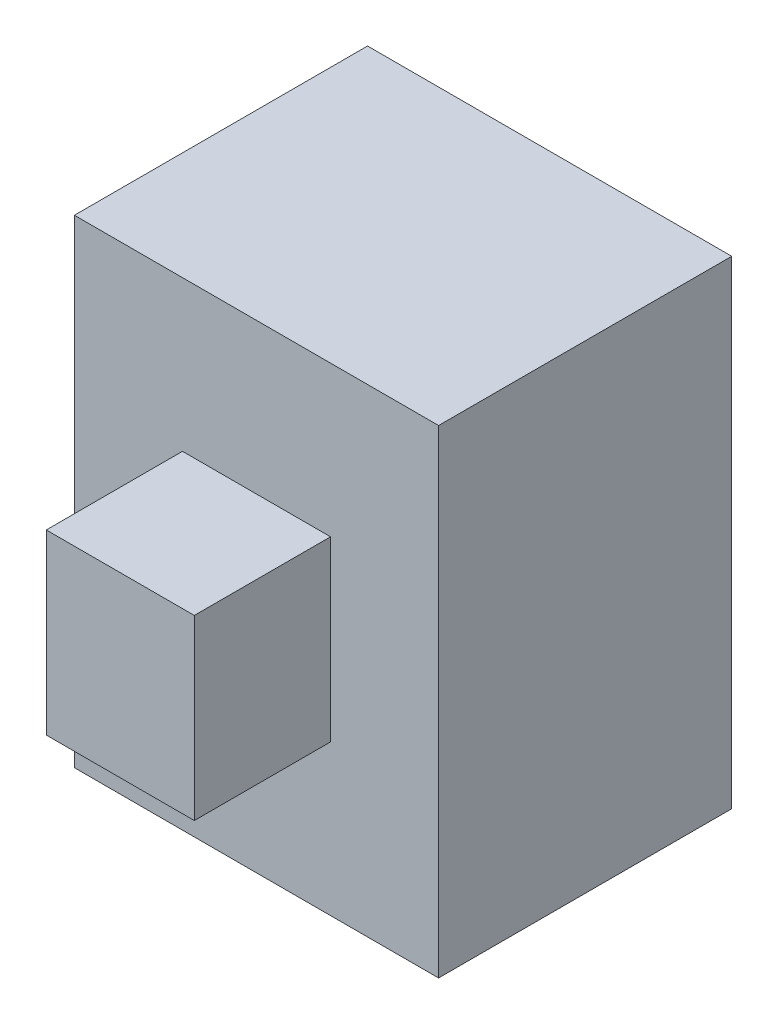
ISO-10303-21;
HEADER;
FILE_DESCRIPTION(('STEP AP214'),'2;1');
FILE_NAME('part.step','',(''),(''),'','','');
FILE_SCHEMA(('AUTOMOTIVE_DESIGN { 1 0 10303 214 1 1 1 1 }'));
ENDSEC;
DATA;
#1=APPLICATION_CONTEXT('core data for automotive mechanical design processes');
#2=APPLICATION_PROTOCOL_DEFINITION('international standard','automotive_design',2000,#1);
#3=PRODUCT_CONTEXT('',#1,'mechanical');
#4=PRODUCT('Part','Part','',(#3));
#5=PRODUCT_RELATED_PRODUCT_CATEGORY('part','',(#4));
#6=PRODUCT_DEFINITION_FORMATION('','',#4);
#7=PRODUCT_DEFINITION_CONTEXT('part definition',#1,'design');
#8=PRODUCT_DEFINITION('design','',#6,#7);
#9=PRODUCT_DEFINITION_SHAPE('','',#8);
#10=(LENGTH_UNIT() NAMED_UNIT(*) SI_UNIT(.MILLI.,.METRE.));
#11=(NAMED_UNIT(*) PLANE_ANGLE_UNIT() SI_UNIT($,.RADIAN.));
#12=(NAMED_UNIT(*) SI_UNIT($,.STERADIAN.) SOLID_ANGLE_UNIT());
#13=UNCERTAINTY_MEASURE_WITH_UNIT(LENGTH_MEASURE(1.E-05),#10,'distance_accuracy_value','');
#14=(GEOMETRIC_REPRESENTATION_CONTEXT(3) GLOBAL_UNCERTAINTY_ASSIGNED_CONTEXT((#13)) GLOBAL_UNIT_ASSIGNED_CONTEXT((#10,
#11,#12)) REPRESENTATION_CONTEXT('',''));
#15=CARTESIAN_POINT('',(0.,0.,0.));
#16=DIRECTION('',(0.,0.,1.));
#17=DIRECTION('',(1.,0.,0.));
#18=AXIS2_PLACEMENT_3D('',#15,#16,#17);
#19=CARTESIAN_POINT('',(0.,0.,12.573));
#20=DIRECTION('',(0.,0.,-1.));
#21=DIRECTION('',(-1.,0.,0.));
#22=AXIS2_PLACEMENT_3D('',#19,#20,#21);
#23=PLANE('',#22);
#24=DIRECTION('',(0.,1.,0.));
#25=VECTOR('',#24,1.);
#26=CARTESIAN_POINT('',(-7.8105,-10.2616,12.573));
#27=LINE('',#26,#25);
#28=CARTESIAN_POINT('',(-7.8105,-10.2616,12.573));
#29=VERTEX_POINT('',#28);
#30=CARTESIAN_POINT('',(-7.8105,10.2616,12.573));
#31=VERTEX_POINT('',#30);
#32=EDGE_CURVE('E129',#29,#31,#27,.T.);
#33=ORIENTED_EDGE('',*,*,#32,.F.);
#34=DIRECTION('',(1.,0.,0.));
#35=VECTOR('',#34,1.);
#36=CARTESIAN_POINT('',(-7.8105,-10.2616,12.573));
#37=LINE('',#36,#35);
#38=CARTESIAN_POINT('',(7.8105,-10.2616,12.573));
#39=VERTEX_POINT('',#38);
#40=EDGE_CURVE('E138',#29,#39,#37,.T.);
#41=ORIENTED_EDGE('',*,*,#40,.T.);
#42=DIRECTION('',(0.,1.,0.));
#43=VECTOR('',#42,1.);
#44=CARTESIAN_POINT('',(7.8105,-10.2616,12.573));
#45=LINE('',#44,#43);
#46=CARTESIAN_POINT('',(7.8105,10.2616,12.573));
#47=VERTEX_POINT('',#46);
#48=EDGE_CURVE('E136',#39,#47,#45,.T.);
#49=ORIENTED_EDGE('',*,*,#48,.T.);
#50=DIRECTION('',(1.,0.,0.));
#51=VECTOR('',#50,1.);
#52=CARTESIAN_POINT('',(-7.8105,10.2616,12.573));
#53=LINE('',#52,#51);
#54=EDGE_CURVE('E132',#31,#47,#53,.T.);
#55=ORIENTED_EDGE('',*,*,#54,.F.);
#56=EDGE_LOOP('',(#33,#41,#49,#55));
#57=FACE_BOUND('',#56,.T.);
#58=DIRECTION('',(0.,1.,0.));
#59=VECTOR('',#58,1.);
#60=CARTESIAN_POINT('',(3.175,3.81,12.573));
#61=LINE('',#60,#59);
#62=CARTESIAN_POINT('',(3.175,-3.81,12.573));
#63=VERTEX_POINT('',#62);
#64=CARTESIAN_POINT('',(3.175,3.81,12.573));
#65=VERTEX_POINT('',#64);
#66=EDGE_CURVE('E119',#63,#65,#61,.T.);
#67=ORIENTED_EDGE('',*,*,#66,.F.);
#68=DIRECTION('',(1.,0.,0.));
#69=VECTOR('',#68,1.);
#70=CARTESIAN_POINT('',(-3.175,-3.81,12.573));
#71=LINE('',#70,#69);
#72=CARTESIAN_POINT('',(-3.175,-3.81,12.573));
#73=VERTEX_POINT('',#72);
#74=EDGE_CURVE('E116',#73,#63,#71,.T.);
#75=ORIENTED_EDGE('',*,*,#74,.F.);
#76=DIRECTION('',(0.,-1.,0.));
#77=VECTOR('',#76,1.);
#78=CARTESIAN_POINT('',(-3.175,3.81,12.573));
#79=LINE('',#78,#77);
#80=CARTESIAN_POINT('',(-3.175,3.81,12.573));
#81=VERTEX_POINT('',#80);
#82=EDGE_CURVE('E55',#81,#73,#79,.T.);
#83=ORIENTED_EDGE('',*,*,#82,.F.);
#84=DIRECTION('',(-1.,0.,0.));
#85=VECTOR('',#84,1.);
#86=CARTESIAN_POINT('',(-3.175,3.81,12.573));
#87=LINE('',#86,#85);
#88=EDGE_CURVE('E50',#65,#81,#87,.T.);
#89=ORIENTED_EDGE('',*,*,#88,.F.);
#90=EDGE_LOOP('',(#67,#75,#83,#89));
#91=FACE_BOUND('',#90,.T.);
#92=ADVANCED_FACE('F33',(#57,#91),#23,.F.);
#93=CARTESIAN_POINT('',(-7.8105,-10.2616,12.573));
#94=DIRECTION('',(-1.,0.,0.));
#95=DIRECTION('',(0.,0.,1.));
#96=AXIS2_PLACEMENT_3D('',#93,#94,#95);
#97=PLANE('',#96);
#98=DIRECTION('',(0.,1.,0.));
#99=VECTOR('',#98,1.);
#100=CARTESIAN_POINT('',(-7.8105,-10.2616,0.));
#101=LINE('',#100,#99);
#102=CARTESIAN_POINT('',(-7.8105,-10.2616,0.));
#103=VERTEX_POINT('',#102);
#104=CARTESIAN_POINT('',(-7.8105,10.2616,0.));
#105=VERTEX_POINT('',#104);
#106=EDGE_CURVE('E120',#103,#105,#101,.T.);
#107=ORIENTED_EDGE('',*,*,#106,.F.);
#108=DIRECTION('',(0.,0.,-1.));
#109=VECTOR('',#108,1.);
#110=CARTESIAN_POINT('',(-7.8105,-10.2616,12.573));
#111=LINE('',#110,#109);
#112=EDGE_CURVE('E11',#29,#103,#111,.T.);
#113=ORIENTED_EDGE('',*,*,#112,.F.);
#114=ORIENTED_EDGE('',*,*,#32,.T.);
#115=DIRECTION('',(0.,0.,-1.));
#116=VECTOR('',#115,1.);
#117=CARTESIAN_POINT('',(-7.8105,10.2616,12.573));
#118=LINE('',#117,#116);
#119=EDGE_CURVE('E37',#31,#105,#118,.T.);
#120=ORIENTED_EDGE('',*,*,#119,.T.);
#121=EDGE_LOOP('',(#107,#113,#114,#120));
#122=FACE_BOUND('',#121,.T.);
#123=ADVANCED_FACE('F35',(#122),#97,.T.);
#124=CARTESIAN_POINT('',(-7.8105,-10.2616,12.573));
#125=DIRECTION('',(0.,1.,0.));
#126=DIRECTION('',(0.,0.,1.));
#127=AXIS2_PLACEMENT_3D('',#124,#125,#126);
#128=PLANE('',#127);
#129=DIRECTION('',(1.,0.,0.));
#130=VECTOR('',#129,1.);
#131=CARTESIAN_POINT('',(-7.8105,-10.2616,0.));
#132=LINE('',#131,#130);
#133=CARTESIAN_POINT('',(7.8105,-10.2616,0.));
#134=VERTEX_POINT('',#133);
#135=EDGE_CURVE('E133',#103,#134,#132,.T.);
#136=ORIENTED_EDGE('',*,*,#135,.T.);
#137=DIRECTION('',(0.,0.,-1.));
#138=VECTOR('',#137,1.);
#139=CARTESIAN_POINT('',(7.8105,-10.2616,12.573));
#140=LINE('',#139,#138);
#141=EDGE_CURVE('E42',#39,#134,#140,.T.);
#142=ORIENTED_EDGE('',*,*,#141,.F.);
#143=ORIENTED_EDGE('',*,*,#40,.F.);
#144=ORIENTED_EDGE('',*,*,#112,.T.);
#145=EDGE_LOOP('',(#136,#142,#143,#144));
#146=FACE_BOUND('',#145,.T.);
#147=ADVANCED_FACE('F162',(#146),#128,.F.);
#148=CARTESIAN_POINT('',(7.8105,-10.2616,12.573));
#149=DIRECTION('',(-1.,0.,0.));
#150=DIRECTION('',(0.,0.,1.));
#151=AXIS2_PLACEMENT_3D('',#148,#149,#150);
#152=PLANE('',#151);
#153=DIRECTION('',(0.,1.,0.));
#154=VECTOR('',#153,1.);
#155=CARTESIAN_POINT('',(7.8105,-10.2616,0.));
#156=LINE('',#155,#154);
#157=CARTESIAN_POINT('',(7.8105,10.2616,0.));
#158=VERTEX_POINT('',#157);
#159=EDGE_CURVE('E142',#134,#158,#156,.T.);
#160=ORIENTED_EDGE('',*,*,#159,.T.);
#161=DIRECTION('',(0.,0.,-1.));
#162=VECTOR('',#161,1.);
#163=CARTESIAN_POINT('',(7.8105,10.2616,12.573));
#164=LINE('',#163,#162);
#165=EDGE_CURVE('E147',#47,#158,#164,.T.);
#166=ORIENTED_EDGE('',*,*,#165,.F.);
#167=ORIENTED_EDGE('',*,*,#48,.F.);
#168=ORIENTED_EDGE('',*,*,#141,.T.);
#169=EDGE_LOOP('',(#160,#166,#167,#168));
#170=FACE_BOUND('',#169,.T.);
#171=ADVANCED_FACE('F166',(#170),#152,.F.);
#172=CARTESIAN_POINT('',(-7.8105,10.2616,12.573));
#173=DIRECTION('',(0.,1.,0.));
#174=DIRECTION('',(0.,0.,1.));
#175=AXIS2_PLACEMENT_3D('',#172,#173,#174);
#176=PLANE('',#175);
#177=DIRECTION('',(1.,0.,0.));
#178=VECTOR('',#177,1.);
#179=CARTESIAN_POINT('',(-7.8105,10.2616,0.));
#180=LINE('',#179,#178);
#181=EDGE_CURVE('E123',#105,#158,#180,.T.);
#182=ORIENTED_EDGE('',*,*,#181,.F.);
#183=ORIENTED_EDGE('',*,*,#119,.F.);
#184=ORIENTED_EDGE('',*,*,#54,.T.);
#185=ORIENTED_EDGE('',*,*,#165,.T.);
#186=EDGE_LOOP('',(#182,#183,#184,#185));
#187=FACE_BOUND('',#186,.T.);
#188=ADVANCED_FACE('F155',(#187),#176,.T.);
#189=CARTESIAN_POINT('',(0.,0.,0.));
#190=DIRECTION('',(0.,0.,-1.));
#191=DIRECTION('',(-1.,0.,0.));
#192=AXIS2_PLACEMENT_3D('',#189,#190,#191);
#193=PLANE('',#192);
#194=ORIENTED_EDGE('',*,*,#106,.T.);
#195=ORIENTED_EDGE('',*,*,#181,.T.);
#196=ORIENTED_EDGE('',*,*,#159,.F.);
#197=ORIENTED_EDGE('',*,*,#135,.F.);
#198=EDGE_LOOP('',(#194,#195,#196,#197));
#199=FACE_BOUND('',#198,.T.);
#200=ADVANCED_FACE('F159',(#199),#193,.T.);
#201=CARTESIAN_POINT('',(3.175,3.81,18.415));
#202=DIRECTION('',(-1.,0.,0.));
#203=DIRECTION('',(0.,-1.,0.));
#204=AXIS2_PLACEMENT_3D('',#201,#202,#203);
#205=PLANE('',#204);
#206=ORIENTED_EDGE('',*,*,#66,.T.);
#207=DIRECTION('',(0.,0.,-1.));
#208=VECTOR('',#207,1.);
#209=CARTESIAN_POINT('',(3.175,3.81,18.415));
#210=LINE('',#209,#208);
#211=CARTESIAN_POINT('',(3.175,3.81,18.415));
#212=VERTEX_POINT('',#211);
#213=EDGE_CURVE('E100',#212,#65,#210,.T.);
#214=ORIENTED_EDGE('',*,*,#213,.F.);
#215=DIRECTION('',(0.,1.,0.));
#216=VECTOR('',#215,1.);
#217=CARTESIAN_POINT('',(3.175,3.81,18.415));
#218=LINE('',#217,#216);
#219=CARTESIAN_POINT('',(3.175,-3.81,18.415));
#220=VERTEX_POINT('',#219);
#221=EDGE_CURVE('E107',#220,#212,#218,.T.);
#222=ORIENTED_EDGE('',*,*,#221,.F.);
#223=DIRECTION('',(0.,0.,-1.));
#224=VECTOR('',#223,1.);
#225=CARTESIAN_POINT('',(3.175,-3.81,18.415));
#226=LINE('',#225,#224);
#227=EDGE_CURVE('E175',#220,#63,#226,.T.);
#228=ORIENTED_EDGE('',*,*,#227,.T.);
#229=EDGE_LOOP('',(#206,#214,#222,#228));
#230=FACE_BOUND('',#229,.T.);
#231=ADVANCED_FACE('F118',(#230),#205,.F.);
#232=CARTESIAN_POINT('',(-3.175,3.81,18.415));
#233=DIRECTION('',(0.,-1.,0.));
#234=DIRECTION('',(0.,0.,-1.));
#235=AXIS2_PLACEMENT_3D('',#232,#233,#234);
#236=PLANE('',#235);
#237=ORIENTED_EDGE('',*,*,#88,.T.);
#238=DIRECTION('',(0.,0.,-1.));
#239=VECTOR('',#238,1.);
#240=CARTESIAN_POINT('',(-3.175,3.81,18.415));
#241=LINE('',#240,#239);
#242=CARTESIAN_POINT('',(-3.175,3.81,18.415));
#243=VERTEX_POINT('',#242);
#244=EDGE_CURVE('E103',#243,#81,#241,.T.);
#245=ORIENTED_EDGE('',*,*,#244,.F.);
#246=DIRECTION('',(-1.,0.,0.));
#247=VECTOR('',#246,1.);
#248=CARTESIAN_POINT('',(-3.175,3.81,18.415));
#249=LINE('',#248,#247);
#250=EDGE_CURVE('E96',#212,#243,#249,.T.);
#251=ORIENTED_EDGE('',*,*,#250,.F.);
#252=ORIENTED_EDGE('',*,*,#213,.T.);
#253=EDGE_LOOP('',(#237,#245,#251,#252));
#254=FACE_BOUND('',#253,.T.);
#255=ADVANCED_FACE('F98',(#254),#236,.F.);
#256=CARTESIAN_POINT('',(-3.175,3.81,18.415));
#257=DIRECTION('',(1.,0.,0.));
#258=DIRECTION('',(0.,1.,0.));
#259=AXIS2_PLACEMENT_3D('',#256,#257,#258);
#260=PLANE('',#259);
#261=ORIENTED_EDGE('',*,*,#82,.T.);
#262=DIRECTION('',(0.,0.,-1.));
#263=VECTOR('',#262,1.);
#264=CARTESIAN_POINT('',(-3.175,-3.81,18.415));
#265=LINE('',#264,#263);
#266=CARTESIAN_POINT('',(-3.175,-3.81,18.415));
#267=VERTEX_POINT('',#266);
#268=EDGE_CURVE('E125',#267,#73,#265,.T.);
#269=ORIENTED_EDGE('',*,*,#268,.F.);
#270=DIRECTION('',(0.,-1.,0.));
#271=VECTOR('',#270,1.);
#272=CARTESIAN_POINT('',(-3.175,3.81,18.415));
#273=LINE('',#272,#271);
#274=EDGE_CURVE('E106',#243,#267,#273,.T.);
#275=ORIENTED_EDGE('',*,*,#274,.F.);
#276=ORIENTED_EDGE('',*,*,#244,.T.);
#277=EDGE_LOOP('',(#261,#269,#275,#276));
#278=FACE_BOUND('',#277,.T.);
#279=ADVANCED_FACE('F184',(#278),#260,.F.);
#280=CARTESIAN_POINT('',(-3.175,-3.81,18.415));
#281=DIRECTION('',(0.,1.,0.));
#282=DIRECTION('',(0.,0.,1.));
#283=AXIS2_PLACEMENT_3D('',#280,#281,#282);
#284=PLANE('',#283);
#285=ORIENTED_EDGE('',*,*,#74,.T.);
#286=ORIENTED_EDGE('',*,*,#227,.F.);
#287=DIRECTION('',(1.,0.,0.));
#288=VECTOR('',#287,1.);
#289=CARTESIAN_POINT('',(-3.175,-3.81,18.415));
#290=LINE('',#289,#288);
#291=EDGE_CURVE('E112',#267,#220,#290,.T.);
#292=ORIENTED_EDGE('',*,*,#291,.F.);
#293=ORIENTED_EDGE('',*,*,#268,.T.);
#294=EDGE_LOOP('',(#285,#286,#292,#293));
#295=FACE_BOUND('',#294,.T.);
#296=ADVANCED_FACE('F174',(#295),#284,.F.);
#297=CARTESIAN_POINT('',(0.,0.,18.415));
#298=DIRECTION('',(0.,0.,1.));
#299=DIRECTION('',(1.,0.,0.));
#300=AXIS2_PLACEMENT_3D('',#297,#298,#299);
#301=PLANE('',#300);
#302=ORIENTED_EDGE('',*,*,#221,.T.);
#303=ORIENTED_EDGE('',*,*,#250,.T.);
#304=ORIENTED_EDGE('',*,*,#274,.T.);
#305=ORIENTED_EDGE('',*,*,#291,.T.);
#306=EDGE_LOOP('',(#302,#303,#304,#305));
#307=FACE_BOUND('',#306,.T.);
#308=ADVANCED_FACE('F110',(#307),#301,.T.);
#309=CLOSED_SHELL('',(#92,#123,#147,#171,#188,#200,#231,#255,#279,#296,#308));
#310=MANIFOLD_SOLID_BREP('B2',#309);
#311=ADVANCED_BREP_SHAPE_REPRESENTATION('',(#18,#310),#14);
#312=SHAPE_DEFINITION_REPRESENTATION(#9,#311);
ENDSEC;
END-ISO-10303-21;
